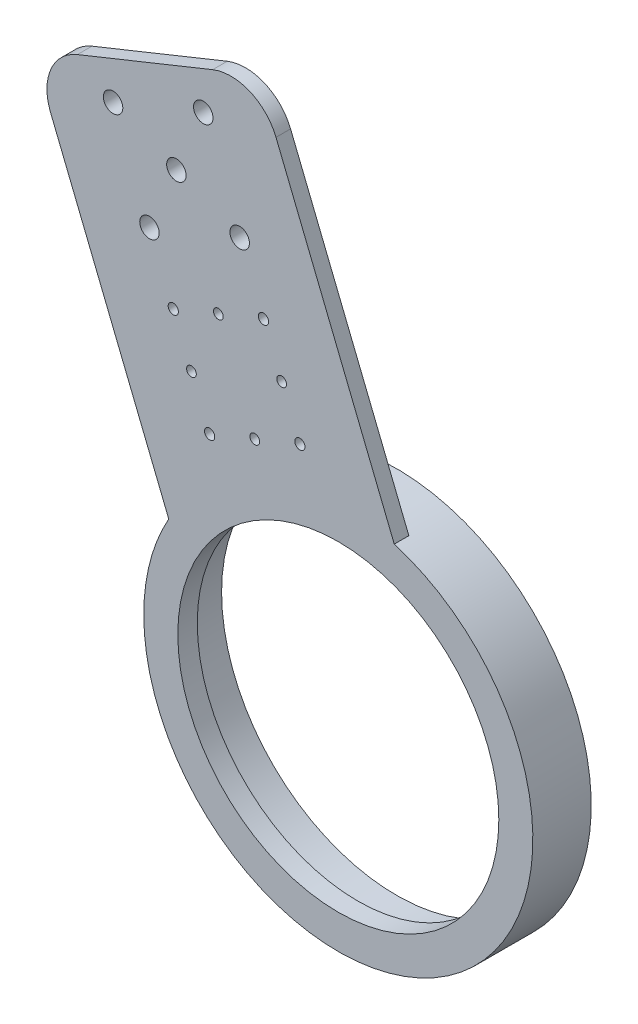
ISO-10303-21;
HEADER;
FILE_DESCRIPTION(('STEP AP214'),'2;1');
FILE_NAME('part.step','',(''),(''),'','','');
FILE_SCHEMA(('AUTOMOTIVE_DESIGN { 1 0 10303 214 1 1 1 1 }'));
ENDSEC;
DATA;
#1=APPLICATION_CONTEXT('core data for automotive mechanical design processes');
#2=APPLICATION_PROTOCOL_DEFINITION('international standard','automotive_design',2000,#1);
#3=PRODUCT_CONTEXT('',#1,'mechanical');
#4=PRODUCT('Part','Part','',(#3));
#5=PRODUCT_RELATED_PRODUCT_CATEGORY('part','',(#4));
#6=PRODUCT_DEFINITION_FORMATION('','',#4);
#7=PRODUCT_DEFINITION_CONTEXT('part definition',#1,'design');
#8=PRODUCT_DEFINITION('design','',#6,#7);
#9=PRODUCT_DEFINITION_SHAPE('','',#8);
#10=(LENGTH_UNIT() NAMED_UNIT(*) SI_UNIT(.MILLI.,.METRE.));
#11=(NAMED_UNIT(*) PLANE_ANGLE_UNIT() SI_UNIT($,.RADIAN.));
#12=(NAMED_UNIT(*) SI_UNIT($,.STERADIAN.) SOLID_ANGLE_UNIT());
#13=UNCERTAINTY_MEASURE_WITH_UNIT(LENGTH_MEASURE(1.E-05),#10,'distance_accuracy_value','');
#14=(GEOMETRIC_REPRESENTATION_CONTEXT(3) GLOBAL_UNCERTAINTY_ASSIGNED_CONTEXT((#13)) GLOBAL_UNIT_ASSIGNED_CONTEXT((#10,
#11,#12)) REPRESENTATION_CONTEXT('',''));
#15=CARTESIAN_POINT('',(0.,0.,0.));
#16=DIRECTION('',(0.,0.,1.));
#17=DIRECTION('',(1.,0.,0.));
#18=AXIS2_PLACEMENT_3D('',#15,#16,#17);
#19=CARTESIAN_POINT('',(-86.606649797073,-63.7835303855202,4.));
#20=DIRECTION('',(0.,0.,-1.));
#21=DIRECTION('',(-1.,0.,0.));
#22=AXIS2_PLACEMENT_3D('',#19,#20,#21);
#23=CYLINDRICAL_SURFACE('',#22,40.);
#24=CARTESIAN_POINT('',(-86.6066497970745,-63.7835303855214,-8.));
#25=DIRECTION('',(0.,0.,-1.));
#26=DIRECTION('',(-1.,0.,0.));
#27=AXIS2_PLACEMENT_3D('',#24,#25,#26);
#28=CIRCLE('',#27,40.0000000000014);
#29=CARTESIAN_POINT('',(-126.606649797076,-63.7835303855214,-8.));
#30=VERTEX_POINT('',#29);
#31=EDGE_CURVE('E216',#30,#30,#28,.T.);
#32=ORIENTED_EDGE('',*,*,#31,.F.);
#33=EDGE_LOOP('',(#32));
#34=FACE_BOUND('',#33,.T.);
#35=DIRECTION('',(0.,0.,1.));
#36=VECTOR('',#35,1.);
#37=CARTESIAN_POINT('',(-75.1035468772114,-25.4732364266497,1.));
#38=LINE('',#37,#36);
#39=CARTESIAN_POINT('',(-75.1035468772114,-25.4732364266497,1.));
#40=VERTEX_POINT('',#39);
#41=CARTESIAN_POINT('',(-75.1035468772114,-25.4732364266497,4.));
#42=VERTEX_POINT('',#41);
#43=EDGE_CURVE('E130',#40,#42,#38,.T.);
#44=ORIENTED_EDGE('',*,*,#43,.T.);
#45=CARTESIAN_POINT('',(-86.606649797073,-63.7835303855202,4.));
#46=DIRECTION('',(0.,0.,1.));
#47=DIRECTION('',(1.,0.,0.));
#48=AXIS2_PLACEMENT_3D('',#45,#46,#47);
#49=CIRCLE('',#48,40.);
#50=CARTESIAN_POINT('',(-121.472800578853,-44.1786450335945,4.));
#51=VERTEX_POINT('',#50);
#52=EDGE_CURVE('E141',#51,#42,#49,.T.);
#53=ORIENTED_EDGE('',*,*,#52,.F.);
#54=DIRECTION('',(0.,0.,1.));
#55=VECTOR('',#54,1.);
#56=CARTESIAN_POINT('',(-121.472800578853,-44.1786450335945,1.));
#57=LINE('',#56,#55);
#58=CARTESIAN_POINT('',(-121.472800578853,-44.1786450335945,1.));
#59=VERTEX_POINT('',#58);
#60=EDGE_CURVE('E195',#59,#51,#57,.T.);
#61=ORIENTED_EDGE('',*,*,#60,.F.);
#62=CARTESIAN_POINT('',(-86.606649797073,-63.7835303855202,1.));
#63=DIRECTION('',(0.,0.,1.));
#64=DIRECTION('',(1.,0.,0.));
#65=AXIS2_PLACEMENT_3D('',#62,#63,#64);
#66=CIRCLE('',#65,40.);
#67=EDGE_CURVE('E143',#40,#59,#66,.T.);
#68=ORIENTED_EDGE('',*,*,#67,.F.);
#69=EDGE_LOOP('',(#44,#53,#61,#68));
#70=FACE_BOUND('',#69,.T.);
#71=ADVANCED_FACE('F71',(#34,#70),#23,.T.);
#72=CARTESIAN_POINT('',(-86.606649797073,-63.7835303855202,0.));
#73=DIRECTION('',(0.,0.,1.));
#74=DIRECTION('',(1.,0.,0.));
#75=AXIS2_PLACEMENT_3D('',#72,#73,#74);
#76=PLANE('',#75);
#77=CARTESIAN_POINT('',(-86.606649797073,-63.7835303855202,0.));
#78=DIRECTION('',(0.,0.,1.));
#79=DIRECTION('',(1.,0.,0.));
#80=AXIS2_PLACEMENT_3D('',#77,#78,#79);
#81=CIRCLE('',#80,32.9999999999998);
#82=CARTESIAN_POINT('',(-53.6066497970732,-63.7835303855202,0.));
#83=VERTEX_POINT('',#82);
#84=EDGE_CURVE('E162',#83,#83,#81,.T.);
#85=ORIENTED_EDGE('',*,*,#84,.T.);
#86=EDGE_LOOP('',(#85));
#87=FACE_BOUND('',#86,.T.);
#88=CARTESIAN_POINT('',(-86.6066497970745,-63.7835303855214,0.));
#89=DIRECTION('',(0.,0.,-1.));
#90=DIRECTION('',(-1.,0.,0.));
#91=AXIS2_PLACEMENT_3D('',#88,#89,#90);
#92=CIRCLE('',#91,36.0000000000021);
#93=CARTESIAN_POINT('',(-122.606649797077,-63.7835303855214,0.));
#94=VERTEX_POINT('',#93);
#95=EDGE_CURVE('E197',#94,#94,#92,.T.);
#96=ORIENTED_EDGE('',*,*,#95,.T.);
#97=EDGE_LOOP('',(#96));
#98=FACE_BOUND('',#97,.T.);
#99=ADVANCED_FACE('F228',(#87,#98),#76,.F.);
#100=CARTESIAN_POINT('',(-86.606649797073,-63.7835303855202,4.));
#101=DIRECTION('',(0.,0.,1.));
#102=DIRECTION('',(1.,0.,0.));
#103=AXIS2_PLACEMENT_3D('',#100,#101,#102);
#104=PLANE('',#103);
#105=CARTESIAN_POINT('',(-113.059715781161,-24.852893212094,4.));
#106=DIRECTION('',(0.,0.,1.));
#107=DIRECTION('',(1.,0.,0.));
#108=AXIS2_PLACEMENT_3D('',#105,#106,#107);
#109=CIRCLE('',#108,1.04999999999999);
#110=CARTESIAN_POINT('',(-112.009715781161,-24.852893212094,4.));
#111=VERTEX_POINT('',#110);
#112=EDGE_CURVE('E190',#111,#111,#109,.T.);
#113=ORIENTED_EDGE('',*,*,#112,.F.);
#114=EDGE_LOOP('',(#113));
#115=FACE_BOUND('',#114,.T.);
#116=CARTESIAN_POINT('',(-106.887344655717,13.220972184463,4.));
#117=DIRECTION('',(0.,0.,1.));
#118=DIRECTION('',(1.,0.,0.));
#119=AXIS2_PLACEMENT_3D('',#116,#117,#118);
#120=CIRCLE('',#119,2.00000000000001);
#121=CARTESIAN_POINT('',(-104.887344655717,13.220972184463,4.));
#122=VERTEX_POINT('',#121);
#123=EDGE_CURVE('E595',#122,#122,#120,.T.);
#124=ORIENTED_EDGE('',*,*,#123,.F.);
#125=EDGE_LOOP('',(#124));
#126=FACE_BOUND('',#125,.T.);
#127=CARTESIAN_POINT('',(-125.435046136374,5.7388087416851,4.));
#128=DIRECTION('',(0.,0.,1.));
#129=DIRECTION('',(1.,0.,0.));
#130=AXIS2_PLACEMENT_3D('',#127,#128,#129);
#131=CIRCLE('',#130,2.);
#132=CARTESIAN_POINT('',(-123.435046136374,5.7388087416851,4.));
#133=VERTEX_POINT('',#132);
#134=EDGE_CURVE('E591',#133,#133,#131,.T.);
#135=ORIENTED_EDGE('',*,*,#134,.F.);
#136=EDGE_LOOP('',(#135));
#137=FACE_BOUND('',#136,.T.);
#138=CARTESIAN_POINT('',(-119.902277117435,18.7537412034025,4.));
#139=DIRECTION('',(0.,0.,1.));
#140=DIRECTION('',(1.,0.,0.));
#141=AXIS2_PLACEMENT_3D('',#138,#139,#140);
#142=CIRCLE('',#141,2.);
#143=CARTESIAN_POINT('',(-117.902277117435,18.7537412034025,4.));
#144=VERTEX_POINT('',#143);
#145=EDGE_CURVE('E587',#144,#144,#142,.T.);
#146=ORIENTED_EDGE('',*,*,#145,.F.);
#147=EDGE_LOOP('',(#146));
#148=FACE_BOUND('',#147,.T.);
#149=CARTESIAN_POINT('',(-132.917209579152,24.2865102223419,4.));
#150=DIRECTION('',(0.,0.,1.));
#151=DIRECTION('',(1.,0.,0.));
#152=AXIS2_PLACEMENT_3D('',#149,#150,#151);
#153=CIRCLE('',#152,2.00000000000003);
#154=CARTESIAN_POINT('',(-130.917209579152,24.2865102223419,4.));
#155=VERTEX_POINT('',#154);
#156=EDGE_CURVE('E583',#155,#155,#153,.T.);
#157=ORIENTED_EDGE('',*,*,#156,.F.);
#158=EDGE_LOOP('',(#157));
#159=FACE_BOUND('',#158,.T.);
#160=CARTESIAN_POINT('',(-120.541879223938,-6.30519173143721,4.));
#161=DIRECTION('',(0.,0.,1.));
#162=DIRECTION('',(1.,0.,0.));
#163=AXIS2_PLACEMENT_3D('',#160,#161,#162);
#164=CIRCLE('',#163,1.04999999999999);
#165=CARTESIAN_POINT('',(-119.491879223938,-6.30519173143721,4.));
#166=VERTEX_POINT('',#165);
#167=EDGE_CURVE('E579',#166,#166,#164,.T.);
#168=ORIENTED_EDGE('',*,*,#167,.F.);
#169=EDGE_LOOP('',(#168));
#170=FACE_BOUND('',#169,.T.);
#171=CARTESIAN_POINT('',(-101.994177743282,1.17697171134061,4.));
#172=DIRECTION('',(0.,0.,1.));
#173=DIRECTION('',(1.,0.,0.));
#174=AXIS2_PLACEMENT_3D('',#171,#172,#173);
#175=CIRCLE('',#174,1.05000000000001);
#176=CARTESIAN_POINT('',(-100.944177743282,1.17697171134061,4.));
#177=VERTEX_POINT('',#176);
#178=EDGE_CURVE('E575',#177,#177,#175,.T.);
#179=ORIENTED_EDGE('',*,*,#178,.F.);
#180=EDGE_LOOP('',(#179));
#181=FACE_BOUND('',#180,.T.);
#182=CARTESIAN_POINT('',(-94.5120143005038,-17.3707297693162,4.));
#183=DIRECTION('',(0.,0.,1.));
#184=DIRECTION('',(1.,0.,0.));
#185=AXIS2_PLACEMENT_3D('',#182,#183,#184);
#186=CIRCLE('',#185,1.05000000000001);
#187=CARTESIAN_POINT('',(-93.4620143005038,-17.3707297693162,4.));
#188=VERTEX_POINT('',#187);
#189=EDGE_CURVE('E571',#188,#188,#186,.T.);
#190=ORIENTED_EDGE('',*,*,#189,.F.);
#191=EDGE_LOOP('',(#190));
#192=FACE_BOUND('',#191,.T.);
#193=CARTESIAN_POINT('',(-116.80079750255,-15.5790424717656,4.));
#194=DIRECTION('',(0.,0.,1.));
#195=DIRECTION('',(1.,0.,0.));
#196=AXIS2_PLACEMENT_3D('',#193,#194,#195);
#197=CIRCLE('',#196,0.999999999999998);
#198=CARTESIAN_POINT('',(-115.80079750255,-15.5790424717656,4.));
#199=VERTEX_POINT('',#198);
#200=EDGE_CURVE('E567',#199,#199,#197,.T.);
#201=ORIENTED_EDGE('',*,*,#200,.F.);
#202=EDGE_LOOP('',(#201));
#203=FACE_BOUND('',#202,.T.);
#204=CARTESIAN_POINT('',(-98.2530960218927,-8.09687902898779,4.));
#205=DIRECTION('',(0.,0.,1.));
#206=DIRECTION('',(1.,0.,0.));
#207=AXIS2_PLACEMENT_3D('',#204,#205,#206);
#208=CIRCLE('',#207,0.999999999999998);
#209=CARTESIAN_POINT('',(-97.2530960218927,-8.09687902898779,4.));
#210=VERTEX_POINT('',#209);
#211=EDGE_CURVE('E563',#210,#210,#208,.T.);
#212=ORIENTED_EDGE('',*,*,#211,.F.);
#213=EDGE_LOOP('',(#212));
#214=FACE_BOUND('',#213,.T.);
#215=CARTESIAN_POINT('',(-103.785865040832,-21.1118114907051,4.));
#216=DIRECTION('',(0.,0.,1.));
#217=DIRECTION('',(1.,0.,0.));
#218=AXIS2_PLACEMENT_3D('',#215,#216,#217);
#219=CIRCLE('',#218,0.999999999999998);
#220=CARTESIAN_POINT('',(-102.785865040832,-21.1118114907051,4.));
#221=VERTEX_POINT('',#220);
#222=EDGE_CURVE('E559',#221,#221,#219,.T.);
#223=ORIENTED_EDGE('',*,*,#222,.F.);
#224=EDGE_LOOP('',(#223));
#225=FACE_BOUND('',#224,.T.);
#226=CARTESIAN_POINT('',(-111.26802848361,-2.5641100100483,4.));
#227=DIRECTION('',(0.,0.,1.));
#228=DIRECTION('',(1.,0.,0.));
#229=AXIS2_PLACEMENT_3D('',#226,#227,#228);
#230=CIRCLE('',#229,0.999999999999998);
#231=CARTESIAN_POINT('',(-110.26802848361,-2.5641100100483,4.));
#232=VERTEX_POINT('',#231);
#233=EDGE_CURVE('E555',#232,#232,#230,.T.);
#234=ORIENTED_EDGE('',*,*,#233,.F.);
#235=EDGE_LOOP('',(#234));
#236=FACE_BOUND('',#235,.T.);
#237=CARTESIAN_POINT('',(-114.369508098495,31.7686736651198,4.));
#238=DIRECTION('',(0.,0.,1.));
#239=DIRECTION('',(1.,0.,0.));
#240=AXIS2_PLACEMENT_3D('',#237,#238,#239);
#241=CIRCLE('',#240,2.);
#242=CARTESIAN_POINT('',(-112.369508098495,31.7686736651198,4.));
#243=VERTEX_POINT('',#242);
#244=EDGE_CURVE('E551',#243,#243,#241,.T.);
#245=ORIENTED_EDGE('',*,*,#244,.F.);
#246=EDGE_LOOP('',(#245));
#247=FACE_BOUND('',#246,.T.);
#248=DIRECTION('',(-0.927385074032839,-0.374108172138896,0.));
#249=VECTOR('',#248,1.);
#250=CARTESIAN_POINT('',(-29.7316302237604,73.7023998661597,4.));
#251=LINE('',#250,#249);
#252=CARTESIAN_POINT('',(-112.435510527957,40.3395624044243,4.));
#253=VERTEX_POINT('',#252);
#254=CARTESIAN_POINT('',(-140.257062748942,29.1163172402574,4.));
#255=VERTEX_POINT('',#254);
#256=EDGE_CURVE('E193',#253,#255,#251,.T.);
#257=ORIENTED_EDGE('',*,*,#256,.T.);
#258=CARTESIAN_POINT('',(-136.515981027553,19.842466499929,4.));
#259=DIRECTION('',(0.,0.,1.));
#260=DIRECTION('',(1.,0.,0.));
#261=AXIS2_PLACEMENT_3D('',#258,#259,#260);
#262=CIRCLE('',#261,10.);
#263=CARTESIAN_POINT('',(-145.789831767882,16.1013847785401,4.));
#264=VERTEX_POINT('',#263);
#265=EDGE_CURVE('E172',#255,#264,#262,.T.);
#266=ORIENTED_EDGE('',*,*,#265,.T.);
#267=DIRECTION('',(0.374108172138896,-0.927385074032839,0.));
#268=VECTOR('',#267,1.);
#269=CARTESIAN_POINT('',(-119.79928326551,-48.3271643472912,4.));
#270=LINE('',#269,#268);
#271=EDGE_CURVE('E150',#264,#51,#270,.T.);
#272=ORIENTED_EDGE('',*,*,#271,.T.);
#273=ORIENTED_EDGE('',*,*,#52,.T.);
#274=DIRECTION('',(0.374108172138897,-0.927385074032839,0.));
#275=VECTOR('',#274,1.);
#276=CARTESIAN_POINT('',(-73.4300295638682,-29.6217557403465,4.));
#277=LINE('',#276,#275);
#278=CARTESIAN_POINT('',(-99.4205780662397,34.8067933854849,4.));
#279=VERTEX_POINT('',#278);
#280=EDGE_CURVE('E127',#279,#42,#277,.T.);
#281=ORIENTED_EDGE('',*,*,#280,.F.);
#282=CARTESIAN_POINT('',(-108.694428806568,31.0657116640959,4.));
#283=DIRECTION('',(0.,0.,1.));
#284=DIRECTION('',(1.,0.,0.));
#285=AXIS2_PLACEMENT_3D('',#282,#283,#284);
#286=CIRCLE('',#285,10.);
#287=EDGE_CURVE('E169',#279,#253,#286,.T.);
#288=ORIENTED_EDGE('',*,*,#287,.T.);
#289=EDGE_LOOP('',(#257,#266,#272,#273,#281,#288));
#290=FACE_BOUND('',#289,.T.);
#291=CARTESIAN_POINT('',(-86.606649797073,-63.7835303855202,4.));
#292=DIRECTION('',(0.,0.,1.));
#293=DIRECTION('',(1.,0.,0.));
#294=AXIS2_PLACEMENT_3D('',#291,#292,#293);
#295=CIRCLE('',#294,32.9999999999998);
#296=CARTESIAN_POINT('',(-53.6066497970732,-63.7835303855202,4.));
#297=VERTEX_POINT('',#296);
#298=EDGE_CURVE('E154',#297,#297,#295,.T.);
#299=ORIENTED_EDGE('',*,*,#298,.F.);
#300=EDGE_LOOP('',(#299));
#301=FACE_BOUND('',#300,.T.);
#302=ADVANCED_FACE('F148',(#115,#126,#137,#148,#159,#170,#181,#192,#203,#214,#225,#236,#247,
#290,#301),#104,.T.);
#303=CARTESIAN_POINT('',(-86.606649797073,-63.7835303855202,4.));
#304=DIRECTION('',(0.,0.,-1.));
#305=DIRECTION('',(-1.,0.,0.));
#306=AXIS2_PLACEMENT_3D('',#303,#304,#305);
#307=CYLINDRICAL_SURFACE('',#306,32.9999999999998);
#308=ORIENTED_EDGE('',*,*,#298,.T.);
#309=EDGE_LOOP('',(#308));
#310=FACE_BOUND('',#309,.T.);
#311=ORIENTED_EDGE('',*,*,#84,.F.);
#312=EDGE_LOOP('',(#311));
#313=FACE_BOUND('',#312,.T.);
#314=ADVANCED_FACE('F231',(#310,#313),#307,.F.);
#315=CARTESIAN_POINT('',(-86.6066497970745,-63.7835303855214,-8.));
#316=DIRECTION('',(0.,0.,-1.));
#317=DIRECTION('',(-1.,0.,0.));
#318=AXIS2_PLACEMENT_3D('',#315,#316,#317);
#319=PLANE('',#318);
#320=ORIENTED_EDGE('',*,*,#31,.T.);
#321=EDGE_LOOP('',(#320));
#322=FACE_BOUND('',#321,.T.);
#323=CARTESIAN_POINT('',(-86.6066497970745,-63.7835303855214,-8.));
#324=DIRECTION('',(0.,0.,-1.));
#325=DIRECTION('',(-1.,0.,0.));
#326=AXIS2_PLACEMENT_3D('',#323,#324,#325);
#327=CIRCLE('',#326,36.0000000000021);
#328=CARTESIAN_POINT('',(-122.606649797077,-63.7835303855214,-8.));
#329=VERTEX_POINT('',#328);
#330=EDGE_CURVE('E203',#329,#329,#327,.T.);
#331=ORIENTED_EDGE('',*,*,#330,.F.);
#332=EDGE_LOOP('',(#331));
#333=FACE_BOUND('',#332,.T.);
#334=ADVANCED_FACE('F233',(#322,#333),#319,.T.);
#335=CARTESIAN_POINT('',(-86.6066497970745,-63.7835303855214,-8.));
#336=DIRECTION('',(0.,0.,1.));
#337=DIRECTION('',(1.,0.,0.));
#338=AXIS2_PLACEMENT_3D('',#335,#336,#337);
#339=CYLINDRICAL_SURFACE('',#338,36.0000000000021);
#340=ORIENTED_EDGE('',*,*,#330,.T.);
#341=EDGE_LOOP('',(#340));
#342=FACE_BOUND('',#341,.T.);
#343=ORIENTED_EDGE('',*,*,#95,.F.);
#344=EDGE_LOOP('',(#343));
#345=FACE_BOUND('',#344,.T.);
#346=ADVANCED_FACE('F240',(#342,#345),#339,.F.);
#347=CARTESIAN_POINT('',(-29.7316302237604,73.7023998661597,1.));
#348=DIRECTION('',(-0.374108172138896,0.927385074032839,0.));
#349=DIRECTION('',(-0.927385074032839,-0.374108172138896,0.));
#350=AXIS2_PLACEMENT_3D('',#347,#348,#349);
#351=PLANE('',#350);
#352=DIRECTION('',(-0.927385074032839,-0.374108172138896,0.));
#353=VECTOR('',#352,1.);
#354=CARTESIAN_POINT('',(-29.7316302237604,73.7023998661597,1.));
#355=LINE('',#354,#353);
#356=CARTESIAN_POINT('',(-112.435510527957,40.3395624044243,1.));
#357=VERTEX_POINT('',#356);
#358=CARTESIAN_POINT('',(-140.257062748942,29.1163172402574,1.));
#359=VERTEX_POINT('',#358);
#360=EDGE_CURVE('E136',#357,#359,#355,.T.);
#361=ORIENTED_EDGE('',*,*,#360,.T.);
#362=DIRECTION('',(0.,0.,1.));
#363=VECTOR('',#362,1.);
#364=CARTESIAN_POINT('',(-140.257062748942,29.1163172402574,1.));
#365=LINE('',#364,#363);
#366=EDGE_CURVE('E159',#359,#255,#365,.T.);
#367=ORIENTED_EDGE('',*,*,#366,.T.);
#368=ORIENTED_EDGE('',*,*,#256,.F.);
#369=DIRECTION('',(0.,0.,1.));
#370=VECTOR('',#369,1.);
#371=CARTESIAN_POINT('',(-112.435510527957,40.3395624044243,1.));
#372=LINE('',#371,#370);
#373=EDGE_CURVE('E153',#253,#357,#372,.F.);
#374=ORIENTED_EDGE('',*,*,#373,.T.);
#375=EDGE_LOOP('',(#361,#367,#368,#374));
#376=FACE_BOUND('',#375,.T.);
#377=ADVANCED_FACE('F186',(#376),#351,.T.);
#378=CARTESIAN_POINT('',(-73.4300295638682,-29.6217557403465,1.));
#379=DIRECTION('',(-0.927385074032838,-0.374108172138897,0.));
#380=DIRECTION('',(0.374108172138897,-0.927385074032839,0.));
#381=AXIS2_PLACEMENT_3D('',#378,#379,#380);
#382=PLANE('',#381);
#383=DIRECTION('',(0.374108172138897,-0.927385074032839,0.));
#384=VECTOR('',#383,1.);
#385=CARTESIAN_POINT('',(-73.4300295638682,-29.6217557403465,1.));
#386=LINE('',#385,#384);
#387=CARTESIAN_POINT('',(-99.4205780662397,34.8067933854849,1.));
#388=VERTEX_POINT('',#387);
#389=EDGE_CURVE('E207',#388,#40,#386,.T.);
#390=ORIENTED_EDGE('',*,*,#389,.F.);
#391=DIRECTION('',(0.,0.,1.));
#392=VECTOR('',#391,1.);
#393=CARTESIAN_POINT('',(-99.4205780662397,34.8067933854849,4.));
#394=LINE('',#393,#392);
#395=EDGE_CURVE('E12',#388,#279,#394,.T.);
#396=ORIENTED_EDGE('',*,*,#395,.T.);
#397=ORIENTED_EDGE('',*,*,#280,.T.);
#398=ORIENTED_EDGE('',*,*,#43,.F.);
#399=EDGE_LOOP('',(#390,#396,#397,#398));
#400=FACE_BOUND('',#399,.T.);
#401=ADVANCED_FACE('F129',(#400),#382,.F.);
#402=CARTESIAN_POINT('',(-119.79928326551,-48.3271643472912,1.));
#403=DIRECTION('',(-0.927385074032839,-0.374108172138896,0.));
#404=DIRECTION('',(0.374108172138896,-0.927385074032839,0.));
#405=AXIS2_PLACEMENT_3D('',#402,#403,#404);
#406=PLANE('',#405);
#407=ORIENTED_EDGE('',*,*,#271,.F.);
#408=DIRECTION('',(0.,0.,1.));
#409=VECTOR('',#408,1.);
#410=CARTESIAN_POINT('',(-145.789831767882,16.1013847785401,1.));
#411=LINE('',#410,#409);
#412=CARTESIAN_POINT('',(-145.789831767882,16.1013847785401,1.));
#413=VERTEX_POINT('',#412);
#414=EDGE_CURVE('E95',#264,#413,#411,.F.);
#415=ORIENTED_EDGE('',*,*,#414,.T.);
#416=DIRECTION('',(0.374108172138896,-0.927385074032839,0.));
#417=VECTOR('',#416,1.);
#418=CARTESIAN_POINT('',(-119.79928326551,-48.3271643472912,1.));
#419=LINE('',#418,#417);
#420=EDGE_CURVE('E145',#413,#59,#419,.T.);
#421=ORIENTED_EDGE('',*,*,#420,.T.);
#422=ORIENTED_EDGE('',*,*,#60,.T.);
#423=EDGE_LOOP('',(#407,#415,#421,#422));
#424=FACE_BOUND('',#423,.T.);
#425=ADVANCED_FACE('F194',(#424),#406,.T.);
#426=CARTESIAN_POINT('',(0.,0.,1.));
#427=DIRECTION('',(0.,0.,1.));
#428=DIRECTION('',(1.,0.,0.));
#429=AXIS2_PLACEMENT_3D('',#426,#427,#428);
#430=PLANE('',#429);
#431=CARTESIAN_POINT('',(-113.059715781161,-24.852893212094,1.));
#432=DIRECTION('',(0.,0.,-1.));
#433=DIRECTION('',(-1.,0.,0.));
#434=AXIS2_PLACEMENT_3D('',#431,#432,#433);
#435=CIRCLE('',#434,1.04999999999999);
#436=CARTESIAN_POINT('',(-114.109715781161,-24.852893212094,1.));
#437=VERTEX_POINT('',#436);
#438=EDGE_CURVE('E485',#437,#437,#435,.T.);
#439=ORIENTED_EDGE('',*,*,#438,.F.);
#440=EDGE_LOOP('',(#439));
#441=FACE_BOUND('',#440,.T.);
#442=CARTESIAN_POINT('',(-106.887344655717,13.220972184463,1.));
#443=DIRECTION('',(0.,0.,-1.));
#444=DIRECTION('',(-1.,0.,0.));
#445=AXIS2_PLACEMENT_3D('',#442,#443,#444);
#446=CIRCLE('',#445,2.00000000000001);
#447=CARTESIAN_POINT('',(-108.887344655717,13.220972184463,1.));
#448=VERTEX_POINT('',#447);
#449=EDGE_CURVE('E489',#448,#448,#446,.T.);
#450=ORIENTED_EDGE('',*,*,#449,.F.);
#451=EDGE_LOOP('',(#450));
#452=FACE_BOUND('',#451,.T.);
#453=CARTESIAN_POINT('',(-125.435046136374,5.7388087416851,1.));
#454=DIRECTION('',(0.,0.,-1.));
#455=DIRECTION('',(-1.,0.,0.));
#456=AXIS2_PLACEMENT_3D('',#453,#454,#455);
#457=CIRCLE('',#456,2.);
#458=CARTESIAN_POINT('',(-127.435046136374,5.7388087416851,1.));
#459=VERTEX_POINT('',#458);
#460=EDGE_CURVE('E493',#459,#459,#457,.T.);
#461=ORIENTED_EDGE('',*,*,#460,.F.);
#462=EDGE_LOOP('',(#461));
#463=FACE_BOUND('',#462,.T.);
#464=CARTESIAN_POINT('',(-119.902277117435,18.7537412034025,1.));
#465=DIRECTION('',(0.,0.,-1.));
#466=DIRECTION('',(-1.,0.,0.));
#467=AXIS2_PLACEMENT_3D('',#464,#465,#466);
#468=CIRCLE('',#467,2.);
#469=CARTESIAN_POINT('',(-121.902277117435,18.7537412034025,1.));
#470=VERTEX_POINT('',#469);
#471=EDGE_CURVE('E497',#470,#470,#468,.T.);
#472=ORIENTED_EDGE('',*,*,#471,.F.);
#473=EDGE_LOOP('',(#472));
#474=FACE_BOUND('',#473,.T.);
#475=CARTESIAN_POINT('',(-132.917209579152,24.2865102223419,1.));
#476=DIRECTION('',(0.,0.,-1.));
#477=DIRECTION('',(-1.,0.,0.));
#478=AXIS2_PLACEMENT_3D('',#475,#476,#477);
#479=CIRCLE('',#478,2.00000000000003);
#480=CARTESIAN_POINT('',(-134.917209579152,24.2865102223419,1.));
#481=VERTEX_POINT('',#480);
#482=EDGE_CURVE('E501',#481,#481,#479,.T.);
#483=ORIENTED_EDGE('',*,*,#482,.F.);
#484=EDGE_LOOP('',(#483));
#485=FACE_BOUND('',#484,.T.);
#486=CARTESIAN_POINT('',(-120.541879223938,-6.30519173143721,1.));
#487=DIRECTION('',(0.,0.,-1.));
#488=DIRECTION('',(-1.,0.,0.));
#489=AXIS2_PLACEMENT_3D('',#486,#487,#488);
#490=CIRCLE('',#489,1.04999999999999);
#491=CARTESIAN_POINT('',(-121.591879223938,-6.30519173143721,1.));
#492=VERTEX_POINT('',#491);
#493=EDGE_CURVE('E505',#492,#492,#490,.T.);
#494=ORIENTED_EDGE('',*,*,#493,.F.);
#495=EDGE_LOOP('',(#494));
#496=FACE_BOUND('',#495,.T.);
#497=CARTESIAN_POINT('',(-101.994177743282,1.17697171134061,1.));
#498=DIRECTION('',(0.,0.,-1.));
#499=DIRECTION('',(-1.,0.,0.));
#500=AXIS2_PLACEMENT_3D('',#497,#498,#499);
#501=CIRCLE('',#500,1.05000000000001);
#502=CARTESIAN_POINT('',(-103.044177743282,1.17697171134061,1.));
#503=VERTEX_POINT('',#502);
#504=EDGE_CURVE('E509',#503,#503,#501,.T.);
#505=ORIENTED_EDGE('',*,*,#504,.F.);
#506=EDGE_LOOP('',(#505));
#507=FACE_BOUND('',#506,.T.);
#508=CARTESIAN_POINT('',(-94.5120143005038,-17.3707297693162,1.));
#509=DIRECTION('',(0.,0.,-1.));
#510=DIRECTION('',(-1.,0.,0.));
#511=AXIS2_PLACEMENT_3D('',#508,#509,#510);
#512=CIRCLE('',#511,1.05000000000001);
#513=CARTESIAN_POINT('',(-95.5620143005038,-17.3707297693162,1.));
#514=VERTEX_POINT('',#513);
#515=EDGE_CURVE('E513',#514,#514,#512,.T.);
#516=ORIENTED_EDGE('',*,*,#515,.F.);
#517=EDGE_LOOP('',(#516));
#518=FACE_BOUND('',#517,.T.);
#519=CARTESIAN_POINT('',(-116.80079750255,-15.5790424717656,1.));
#520=DIRECTION('',(0.,0.,-1.));
#521=DIRECTION('',(-1.,0.,0.));
#522=AXIS2_PLACEMENT_3D('',#519,#520,#521);
#523=CIRCLE('',#522,0.999999999999998);
#524=CARTESIAN_POINT('',(-117.80079750255,-15.5790424717656,1.));
#525=VERTEX_POINT('',#524);
#526=EDGE_CURVE('E517',#525,#525,#523,.T.);
#527=ORIENTED_EDGE('',*,*,#526,.F.);
#528=EDGE_LOOP('',(#527));
#529=FACE_BOUND('',#528,.T.);
#530=CARTESIAN_POINT('',(-98.2530960218927,-8.09687902898779,1.));
#531=DIRECTION('',(0.,0.,-1.));
#532=DIRECTION('',(-1.,0.,0.));
#533=AXIS2_PLACEMENT_3D('',#530,#531,#532);
#534=CIRCLE('',#533,0.999999999999998);
#535=CARTESIAN_POINT('',(-99.2530960218927,-8.09687902898779,1.));
#536=VERTEX_POINT('',#535);
#537=EDGE_CURVE('E521',#536,#536,#534,.T.);
#538=ORIENTED_EDGE('',*,*,#537,.F.);
#539=EDGE_LOOP('',(#538));
#540=FACE_BOUND('',#539,.T.);
#541=CARTESIAN_POINT('',(-103.785865040832,-21.1118114907051,1.));
#542=DIRECTION('',(0.,0.,-1.));
#543=DIRECTION('',(-1.,0.,0.));
#544=AXIS2_PLACEMENT_3D('',#541,#542,#543);
#545=CIRCLE('',#544,0.999999999999998);
#546=CARTESIAN_POINT('',(-104.785865040832,-21.1118114907051,1.));
#547=VERTEX_POINT('',#546);
#548=EDGE_CURVE('E525',#547,#547,#545,.T.);
#549=ORIENTED_EDGE('',*,*,#548,.F.);
#550=EDGE_LOOP('',(#549));
#551=FACE_BOUND('',#550,.T.);
#552=CARTESIAN_POINT('',(-111.26802848361,-2.5641100100483,1.));
#553=DIRECTION('',(0.,0.,-1.));
#554=DIRECTION('',(-1.,0.,0.));
#555=AXIS2_PLACEMENT_3D('',#552,#553,#554);
#556=CIRCLE('',#555,0.999999999999998);
#557=CARTESIAN_POINT('',(-112.26802848361,-2.5641100100483,1.));
#558=VERTEX_POINT('',#557);
#559=EDGE_CURVE('E529',#558,#558,#556,.T.);
#560=ORIENTED_EDGE('',*,*,#559,.F.);
#561=EDGE_LOOP('',(#560));
#562=FACE_BOUND('',#561,.T.);
#563=CARTESIAN_POINT('',(-114.369508098495,31.7686736651198,1.));
#564=DIRECTION('',(0.,0.,-1.));
#565=DIRECTION('',(-1.,0.,0.));
#566=AXIS2_PLACEMENT_3D('',#563,#564,#565);
#567=CIRCLE('',#566,2.);
#568=CARTESIAN_POINT('',(-116.369508098495,31.7686736651198,1.));
#569=VERTEX_POINT('',#568);
#570=EDGE_CURVE('E532',#569,#569,#567,.T.);
#571=ORIENTED_EDGE('',*,*,#570,.F.);
#572=EDGE_LOOP('',(#571));
#573=FACE_BOUND('',#572,.T.);
#574=ORIENTED_EDGE('',*,*,#420,.F.);
#575=CARTESIAN_POINT('',(-136.515981027553,19.842466499929,1.));
#576=DIRECTION('',(0.,0.,1.));
#577=DIRECTION('',(1.,0.,0.));
#578=AXIS2_PLACEMENT_3D('',#575,#576,#577);
#579=CIRCLE('',#578,10.);
#580=EDGE_CURVE('E80',#413,#359,#579,.F.);
#581=ORIENTED_EDGE('',*,*,#580,.T.);
#582=ORIENTED_EDGE('',*,*,#360,.F.);
#583=CARTESIAN_POINT('',(-108.694428806568,31.0657116640959,1.));
#584=DIRECTION('',(0.,0.,1.));
#585=DIRECTION('',(1.,0.,0.));
#586=AXIS2_PLACEMENT_3D('',#583,#584,#585);
#587=CIRCLE('',#586,10.);
#588=EDGE_CURVE('E87',#357,#388,#587,.F.);
#589=ORIENTED_EDGE('',*,*,#588,.T.);
#590=ORIENTED_EDGE('',*,*,#389,.T.);
#591=ORIENTED_EDGE('',*,*,#67,.T.);
#592=EDGE_LOOP('',(#574,#581,#582,#589,#590,#591));
#593=FACE_BOUND('',#592,.T.);
#594=ADVANCED_FACE('F182',(#441,#452,#463,#474,#485,#496,#507,#518,#529,#540,#551,#562,#573,
#593),#430,.F.);
#595=CARTESIAN_POINT('',(-114.369508098495,31.7686736651198,6.));
#596=DIRECTION('',(0.,0.,-1.));
#597=DIRECTION('',(-1.,0.,0.));
#598=AXIS2_PLACEMENT_3D('',#595,#596,#597);
#599=CYLINDRICAL_SURFACE('',#598,2.);
#600=ORIENTED_EDGE('',*,*,#244,.T.);
#601=EDGE_LOOP('',(#600));
#602=FACE_BOUND('',#601,.T.);
#603=ORIENTED_EDGE('',*,*,#570,.T.);
#604=EDGE_LOOP('',(#603));
#605=FACE_BOUND('',#604,.T.);
#606=ADVANCED_FACE('F297',(#602,#605),#599,.F.);
#607=CARTESIAN_POINT('',(-111.26802848361,-2.5641100100483,6.));
#608=DIRECTION('',(0.,0.,-1.));
#609=DIRECTION('',(-1.,0.,0.));
#610=AXIS2_PLACEMENT_3D('',#607,#608,#609);
#611=CYLINDRICAL_SURFACE('',#610,0.999999999999998);
#612=ORIENTED_EDGE('',*,*,#233,.T.);
#613=EDGE_LOOP('',(#612));
#614=FACE_BOUND('',#613,.T.);
#615=ORIENTED_EDGE('',*,*,#559,.T.);
#616=EDGE_LOOP('',(#615));
#617=FACE_BOUND('',#616,.T.);
#618=ADVANCED_FACE('F293',(#614,#617),#611,.F.);
#619=CARTESIAN_POINT('',(-103.785865040832,-21.1118114907051,6.));
#620=DIRECTION('',(0.,0.,-1.));
#621=DIRECTION('',(-1.,0.,0.));
#622=AXIS2_PLACEMENT_3D('',#619,#620,#621);
#623=CYLINDRICAL_SURFACE('',#622,0.999999999999998);
#624=ORIENTED_EDGE('',*,*,#222,.T.);
#625=EDGE_LOOP('',(#624));
#626=FACE_BOUND('',#625,.T.);
#627=ORIENTED_EDGE('',*,*,#548,.T.);
#628=EDGE_LOOP('',(#627));
#629=FACE_BOUND('',#628,.T.);
#630=ADVANCED_FACE('F289',(#626,#629),#623,.F.);
#631=CARTESIAN_POINT('',(-98.2530960218927,-8.09687902898779,6.));
#632=DIRECTION('',(0.,0.,-1.));
#633=DIRECTION('',(-1.,0.,0.));
#634=AXIS2_PLACEMENT_3D('',#631,#632,#633);
#635=CYLINDRICAL_SURFACE('',#634,0.999999999999998);
#636=ORIENTED_EDGE('',*,*,#211,.T.);
#637=EDGE_LOOP('',(#636));
#638=FACE_BOUND('',#637,.T.);
#639=ORIENTED_EDGE('',*,*,#537,.T.);
#640=EDGE_LOOP('',(#639));
#641=FACE_BOUND('',#640,.T.);
#642=ADVANCED_FACE('F285',(#638,#641),#635,.F.);
#643=CARTESIAN_POINT('',(-116.80079750255,-15.5790424717656,6.));
#644=DIRECTION('',(0.,0.,-1.));
#645=DIRECTION('',(-1.,0.,0.));
#646=AXIS2_PLACEMENT_3D('',#643,#644,#645);
#647=CYLINDRICAL_SURFACE('',#646,0.999999999999998);
#648=ORIENTED_EDGE('',*,*,#200,.T.);
#649=EDGE_LOOP('',(#648));
#650=FACE_BOUND('',#649,.T.);
#651=ORIENTED_EDGE('',*,*,#526,.T.);
#652=EDGE_LOOP('',(#651));
#653=FACE_BOUND('',#652,.T.);
#654=ADVANCED_FACE('F288',(#650,#653),#647,.F.);
#655=CARTESIAN_POINT('',(-94.5120143005038,-17.3707297693162,6.));
#656=DIRECTION('',(0.,0.,-1.));
#657=DIRECTION('',(-1.,0.,0.));
#658=AXIS2_PLACEMENT_3D('',#655,#656,#657);
#659=CYLINDRICAL_SURFACE('',#658,1.05000000000001);
#660=ORIENTED_EDGE('',*,*,#189,.T.);
#661=EDGE_LOOP('',(#660));
#662=FACE_BOUND('',#661,.T.);
#663=ORIENTED_EDGE('',*,*,#515,.T.);
#664=EDGE_LOOP('',(#663));
#665=FACE_BOUND('',#664,.T.);
#666=ADVANCED_FACE('F307',(#662,#665),#659,.F.);
#667=CARTESIAN_POINT('',(-101.994177743282,1.17697171134061,6.));
#668=DIRECTION('',(0.,0.,-1.));
#669=DIRECTION('',(-1.,0.,0.));
#670=AXIS2_PLACEMENT_3D('',#667,#668,#669);
#671=CYLINDRICAL_SURFACE('',#670,1.05000000000001);
#672=ORIENTED_EDGE('',*,*,#178,.T.);
#673=EDGE_LOOP('',(#672));
#674=FACE_BOUND('',#673,.T.);
#675=ORIENTED_EDGE('',*,*,#504,.T.);
#676=EDGE_LOOP('',(#675));
#677=FACE_BOUND('',#676,.T.);
#678=ADVANCED_FACE('F303',(#674,#677),#671,.F.);
#679=CARTESIAN_POINT('',(-120.541879223938,-6.30519173143721,6.));
#680=DIRECTION('',(0.,0.,-1.));
#681=DIRECTION('',(-1.,0.,0.));
#682=AXIS2_PLACEMENT_3D('',#679,#680,#681);
#683=CYLINDRICAL_SURFACE('',#682,1.04999999999999);
#684=ORIENTED_EDGE('',*,*,#167,.T.);
#685=EDGE_LOOP('',(#684));
#686=FACE_BOUND('',#685,.T.);
#687=ORIENTED_EDGE('',*,*,#493,.T.);
#688=EDGE_LOOP('',(#687));
#689=FACE_BOUND('',#688,.T.);
#690=ADVANCED_FACE('F277',(#686,#689),#683,.F.);
#691=CARTESIAN_POINT('',(-132.917209579152,24.2865102223419,6.));
#692=DIRECTION('',(0.,0.,-1.));
#693=DIRECTION('',(-1.,0.,0.));
#694=AXIS2_PLACEMENT_3D('',#691,#692,#693);
#695=CYLINDRICAL_SURFACE('',#694,2.00000000000003);
#696=ORIENTED_EDGE('',*,*,#156,.T.);
#697=EDGE_LOOP('',(#696));
#698=FACE_BOUND('',#697,.T.);
#699=ORIENTED_EDGE('',*,*,#482,.T.);
#700=EDGE_LOOP('',(#699));
#701=FACE_BOUND('',#700,.T.);
#702=ADVANCED_FACE('F273',(#698,#701),#695,.F.);
#703=CARTESIAN_POINT('',(-119.902277117435,18.7537412034025,6.));
#704=DIRECTION('',(0.,0.,-1.));
#705=DIRECTION('',(-1.,0.,0.));
#706=AXIS2_PLACEMENT_3D('',#703,#704,#705);
#707=CYLINDRICAL_SURFACE('',#706,2.);
#708=ORIENTED_EDGE('',*,*,#145,.T.);
#709=EDGE_LOOP('',(#708));
#710=FACE_BOUND('',#709,.T.);
#711=ORIENTED_EDGE('',*,*,#471,.T.);
#712=EDGE_LOOP('',(#711));
#713=FACE_BOUND('',#712,.T.);
#714=ADVANCED_FACE('F276',(#710,#713),#707,.F.);
#715=CARTESIAN_POINT('',(-125.435046136374,5.7388087416851,6.));
#716=DIRECTION('',(0.,0.,-1.));
#717=DIRECTION('',(-1.,0.,0.));
#718=AXIS2_PLACEMENT_3D('',#715,#716,#717);
#719=CYLINDRICAL_SURFACE('',#718,2.);
#720=ORIENTED_EDGE('',*,*,#134,.T.);
#721=EDGE_LOOP('',(#720));
#722=FACE_BOUND('',#721,.T.);
#723=ORIENTED_EDGE('',*,*,#460,.T.);
#724=EDGE_LOOP('',(#723));
#725=FACE_BOUND('',#724,.T.);
#726=ADVANCED_FACE('F267',(#722,#725),#719,.F.);
#727=CARTESIAN_POINT('',(-106.887344655717,13.220972184463,6.));
#728=DIRECTION('',(0.,0.,-1.));
#729=DIRECTION('',(-1.,0.,0.));
#730=AXIS2_PLACEMENT_3D('',#727,#728,#729);
#731=CYLINDRICAL_SURFACE('',#730,2.00000000000001);
#732=ORIENTED_EDGE('',*,*,#123,.T.);
#733=EDGE_LOOP('',(#732));
#734=FACE_BOUND('',#733,.T.);
#735=ORIENTED_EDGE('',*,*,#449,.T.);
#736=EDGE_LOOP('',(#735));
#737=FACE_BOUND('',#736,.T.);
#738=ADVANCED_FACE('F261',(#734,#737),#731,.F.);
#739=CARTESIAN_POINT('',(-113.059715781161,-24.852893212094,6.));
#740=DIRECTION('',(0.,0.,-1.));
#741=DIRECTION('',(-1.,0.,0.));
#742=AXIS2_PLACEMENT_3D('',#739,#740,#741);
#743=CYLINDRICAL_SURFACE('',#742,1.04999999999999);
#744=ORIENTED_EDGE('',*,*,#112,.T.);
#745=EDGE_LOOP('',(#744));
#746=FACE_BOUND('',#745,.T.);
#747=ORIENTED_EDGE('',*,*,#438,.T.);
#748=EDGE_LOOP('',(#747));
#749=FACE_BOUND('',#748,.T.);
#750=ADVANCED_FACE('F254',(#746,#749),#743,.F.);
#751=CARTESIAN_POINT('',(-136.515981027553,19.842466499929,1.));
#752=DIRECTION('',(0.,0.,1.));
#753=DIRECTION('',(1.,0.,0.));
#754=AXIS2_PLACEMENT_3D('',#751,#752,#753);
#755=CYLINDRICAL_SURFACE('',#754,10.);
#756=ORIENTED_EDGE('',*,*,#580,.F.);
#757=ORIENTED_EDGE('',*,*,#414,.F.);
#758=ORIENTED_EDGE('',*,*,#265,.F.);
#759=ORIENTED_EDGE('',*,*,#366,.F.);
#760=EDGE_LOOP('',(#756,#757,#758,#759));
#761=FACE_BOUND('',#760,.T.);
#762=ADVANCED_FACE('F192',(#761),#755,.T.);
#763=CARTESIAN_POINT('',(-108.694428806568,31.0657116640959,1.));
#764=DIRECTION('',(0.,0.,-1.));
#765=DIRECTION('',(-1.,0.,0.));
#766=AXIS2_PLACEMENT_3D('',#763,#764,#765);
#767=CYLINDRICAL_SURFACE('',#766,10.);
#768=ORIENTED_EDGE('',*,*,#588,.F.);
#769=ORIENTED_EDGE('',*,*,#373,.F.);
#770=ORIENTED_EDGE('',*,*,#287,.F.);
#771=ORIENTED_EDGE('',*,*,#395,.F.);
#772=EDGE_LOOP('',(#768,#769,#770,#771));
#773=FACE_BOUND('',#772,.T.);
#774=ADVANCED_FACE('F73',(#773),#767,.T.);
#775=CLOSED_SHELL('',(#71,#99,#302,#314,#334,#346,#377,#401,#425,#594,#606,#618,#630,#642,#654,
#666,#678,#690,#702,#714,#726,#738,#750,#762,#774));
#776=MANIFOLD_SOLID_BREP('B2',#775);
#777=ADVANCED_BREP_SHAPE_REPRESENTATION('',(#18,#776),#14);
#778=SHAPE_DEFINITION_REPRESENTATION(#9,#777);
ENDSEC;
END-ISO-10303-21;
